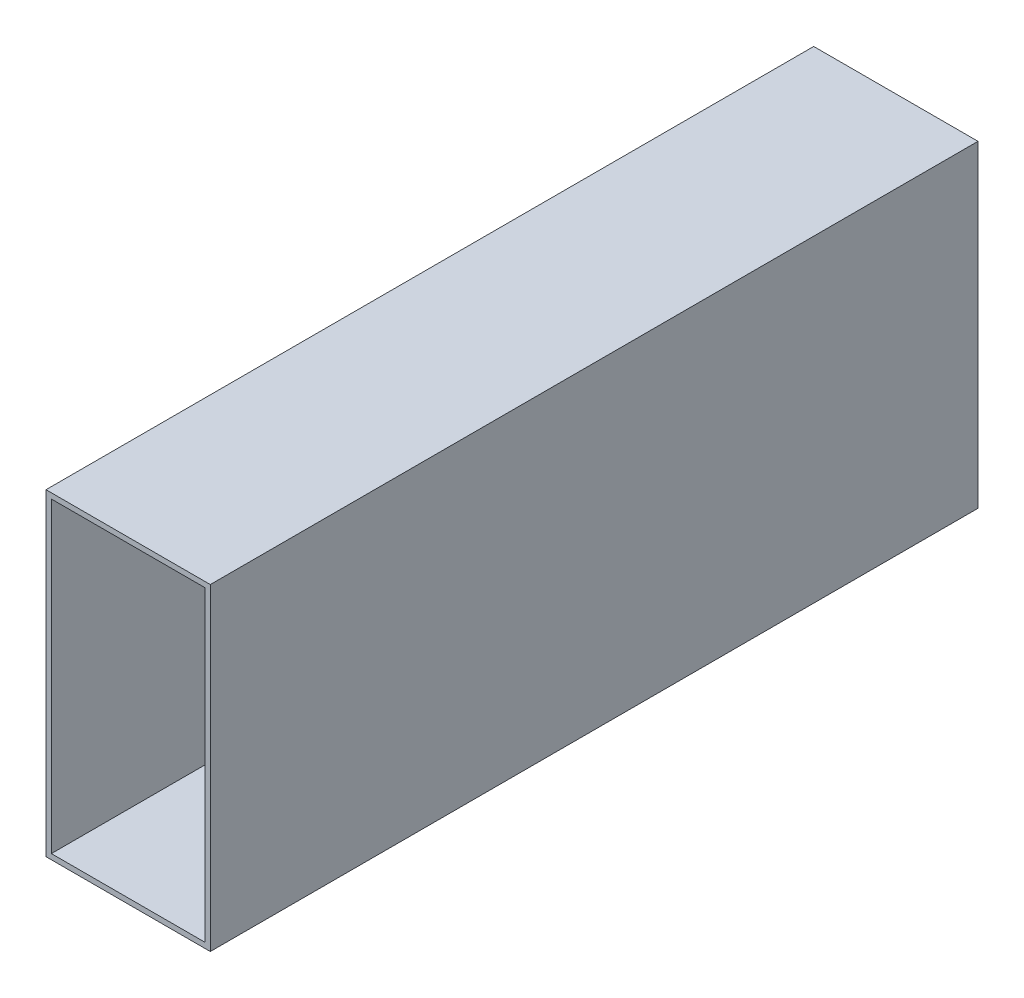
ISO-10303-21;
HEADER;
FILE_DESCRIPTION(('STEP AP214'),'2;1');
FILE_NAME('part.step','',(''),(''),'','','');
FILE_SCHEMA(('AUTOMOTIVE_DESIGN { 1 0 10303 214 1 1 1 1 }'));
ENDSEC;
DATA;
#1=APPLICATION_CONTEXT('core data for automotive mechanical design processes');
#2=APPLICATION_PROTOCOL_DEFINITION('international standard','automotive_design',2000,#1);
#3=PRODUCT_CONTEXT('',#1,'mechanical');
#4=PRODUCT('Part','Part','',(#3));
#5=PRODUCT_RELATED_PRODUCT_CATEGORY('part','',(#4));
#6=PRODUCT_DEFINITION_FORMATION('','',#4);
#7=PRODUCT_DEFINITION_CONTEXT('part definition',#1,'design');
#8=PRODUCT_DEFINITION('design','',#6,#7);
#9=PRODUCT_DEFINITION_SHAPE('','',#8);
#10=(LENGTH_UNIT() NAMED_UNIT(*) SI_UNIT(.MILLI.,.METRE.));
#11=(NAMED_UNIT(*) PLANE_ANGLE_UNIT() SI_UNIT($,.RADIAN.));
#12=(NAMED_UNIT(*) SI_UNIT($,.STERADIAN.) SOLID_ANGLE_UNIT());
#13=UNCERTAINTY_MEASURE_WITH_UNIT(LENGTH_MEASURE(1.E-05),#10,'distance_accuracy_value','');
#14=(GEOMETRIC_REPRESENTATION_CONTEXT(3) GLOBAL_UNCERTAINTY_ASSIGNED_CONTEXT((#13)) GLOBAL_UNIT_ASSIGNED_CONTEXT((#10,
#11,#12)) REPRESENTATION_CONTEXT('',''));
#15=CARTESIAN_POINT('',(0.,0.,0.));
#16=DIRECTION('',(0.,0.,1.));
#17=DIRECTION('',(1.,0.,0.));
#18=AXIS2_PLACEMENT_3D('',#15,#16,#17);
#19=CARTESIAN_POINT('',(0.,0.,127.));
#20=DIRECTION('',(-1.,0.,0.));
#21=DIRECTION('',(0.,-1.,0.));
#22=AXIS2_PLACEMENT_3D('',#19,#20,#21);
#23=PLANE('',#22);
#24=DIRECTION('',(0.,1.,0.));
#25=VECTOR('',#24,1.);
#26=CARTESIAN_POINT('',(0.,0.,0.));
#27=LINE('',#26,#25);
#28=CARTESIAN_POINT('',(0.,0.,0.));
#29=VERTEX_POINT('',#28);
#30=CARTESIAN_POINT('',(0.,52.578,0.));
#31=VERTEX_POINT('',#30);
#32=EDGE_CURVE('E168',#29,#31,#27,.T.);
#33=ORIENTED_EDGE('',*,*,#32,.F.);
#34=DIRECTION('',(0.,0.,-1.));
#35=VECTOR('',#34,1.);
#36=CARTESIAN_POINT('',(0.,0.,127.));
#37=LINE('',#36,#35);
#38=CARTESIAN_POINT('',(0.,0.,127.));
#39=VERTEX_POINT('',#38);
#40=EDGE_CURVE('E11',#39,#29,#37,.T.);
#41=ORIENTED_EDGE('',*,*,#40,.F.);
#42=DIRECTION('',(0.,1.,0.));
#43=VECTOR('',#42,1.);
#44=CARTESIAN_POINT('',(0.,0.,127.));
#45=LINE('',#44,#43);
#46=CARTESIAN_POINT('',(0.,52.578,127.));
#47=VERTEX_POINT('',#46);
#48=EDGE_CURVE('E153',#39,#47,#45,.T.);
#49=ORIENTED_EDGE('',*,*,#48,.T.);
#50=DIRECTION('',(0.,0.,-1.));
#51=VECTOR('',#50,1.);
#52=CARTESIAN_POINT('',(0.,52.578,127.));
#53=LINE('',#52,#51);
#54=EDGE_CURVE('E48',#47,#31,#53,.T.);
#55=ORIENTED_EDGE('',*,*,#54,.T.);
#56=EDGE_LOOP('',(#33,#41,#49,#55));
#57=FACE_BOUND('',#56,.T.);
#58=ADVANCED_FACE('F45',(#57),#23,.T.);
#59=CARTESIAN_POINT('',(0.,0.,127.));
#60=DIRECTION('',(0.,1.,0.));
#61=DIRECTION('',(0.,0.,1.));
#62=AXIS2_PLACEMENT_3D('',#59,#60,#61);
#63=PLANE('',#62);
#64=DIRECTION('',(1.,0.,0.));
#65=VECTOR('',#64,1.);
#66=CARTESIAN_POINT('',(0.,0.,0.));
#67=LINE('',#66,#65);
#68=CARTESIAN_POINT('',(27.178,0.,0.));
#69=VERTEX_POINT('',#68);
#70=EDGE_CURVE('E158',#29,#69,#67,.T.);
#71=ORIENTED_EDGE('',*,*,#70,.T.);
#72=DIRECTION('',(0.,0.,-1.));
#73=VECTOR('',#72,1.);
#74=CARTESIAN_POINT('',(27.178,0.,127.));
#75=LINE('',#74,#73);
#76=CARTESIAN_POINT('',(27.178,0.,127.));
#77=VERTEX_POINT('',#76);
#78=EDGE_CURVE('E54',#77,#69,#75,.T.);
#79=ORIENTED_EDGE('',*,*,#78,.F.);
#80=DIRECTION('',(1.,0.,0.));
#81=VECTOR('',#80,1.);
#82=CARTESIAN_POINT('',(0.,0.,127.));
#83=LINE('',#82,#81);
#84=EDGE_CURVE('E165',#39,#77,#83,.T.);
#85=ORIENTED_EDGE('',*,*,#84,.F.);
#86=ORIENTED_EDGE('',*,*,#40,.T.);
#87=EDGE_LOOP('',(#71,#79,#85,#86));
#88=FACE_BOUND('',#87,.T.);
#89=ADVANCED_FACE('F199',(#88),#63,.F.);
#90=CARTESIAN_POINT('',(27.178,0.,127.));
#91=DIRECTION('',(-1.,0.,0.));
#92=DIRECTION('',(0.,-1.,0.));
#93=AXIS2_PLACEMENT_3D('',#90,#91,#92);
#94=PLANE('',#93);
#95=DIRECTION('',(0.,1.,0.));
#96=VECTOR('',#95,1.);
#97=CARTESIAN_POINT('',(27.178,0.,0.));
#98=LINE('',#97,#96);
#99=CARTESIAN_POINT('',(27.178,52.578,0.));
#100=VERTEX_POINT('',#99);
#101=EDGE_CURVE('E176',#69,#100,#98,.T.);
#102=ORIENTED_EDGE('',*,*,#101,.T.);
#103=DIRECTION('',(0.,0.,-1.));
#104=VECTOR('',#103,1.);
#105=CARTESIAN_POINT('',(27.178,52.578,127.));
#106=LINE('',#105,#104);
#107=CARTESIAN_POINT('',(27.178,52.578,127.));
#108=VERTEX_POINT('',#107);
#109=EDGE_CURVE('E184',#108,#100,#106,.T.);
#110=ORIENTED_EDGE('',*,*,#109,.F.);
#111=DIRECTION('',(0.,1.,0.));
#112=VECTOR('',#111,1.);
#113=CARTESIAN_POINT('',(27.178,0.,127.));
#114=LINE('',#113,#112);
#115=EDGE_CURVE('E162',#77,#108,#114,.T.);
#116=ORIENTED_EDGE('',*,*,#115,.F.);
#117=ORIENTED_EDGE('',*,*,#78,.T.);
#118=EDGE_LOOP('',(#102,#110,#116,#117));
#119=FACE_BOUND('',#118,.T.);
#120=ADVANCED_FACE('F203',(#119),#94,.F.);
#121=CARTESIAN_POINT('',(0.,52.578,127.));
#122=DIRECTION('',(0.,1.,0.));
#123=DIRECTION('',(0.,0.,1.));
#124=AXIS2_PLACEMENT_3D('',#121,#122,#123);
#125=PLANE('',#124);
#126=DIRECTION('',(1.,0.,0.));
#127=VECTOR('',#126,1.);
#128=CARTESIAN_POINT('',(0.,52.578,0.));
#129=LINE('',#128,#127);
#130=EDGE_CURVE('E172',#31,#100,#129,.T.);
#131=ORIENTED_EDGE('',*,*,#130,.F.);
#132=ORIENTED_EDGE('',*,*,#54,.F.);
#133=DIRECTION('',(1.,0.,0.));
#134=VECTOR('',#133,1.);
#135=CARTESIAN_POINT('',(0.,52.578,127.));
#136=LINE('',#135,#134);
#137=EDGE_CURVE('E157',#47,#108,#136,.T.);
#138=ORIENTED_EDGE('',*,*,#137,.T.);
#139=ORIENTED_EDGE('',*,*,#109,.T.);
#140=EDGE_LOOP('',(#131,#132,#138,#139));
#141=FACE_BOUND('',#140,.T.);
#142=ADVANCED_FACE('F194',(#141),#125,.T.);
#143=CARTESIAN_POINT('',(0.,0.,127.));
#144=DIRECTION('',(0.,0.,-1.));
#145=DIRECTION('',(-1.,0.,0.));
#146=AXIS2_PLACEMENT_3D('',#143,#144,#145);
#147=PLANE('',#146);
#148=DIRECTION('',(1.,0.,0.));
#149=VECTOR('',#148,1.);
#150=CARTESIAN_POINT('',(0.,0.889,127.));
#151=LINE('',#150,#149);
#152=CARTESIAN_POINT('',(0.889,0.889,127.));
#153=VERTEX_POINT('',#152);
#154=CARTESIAN_POINT('',(26.289,0.889,127.));
#155=VERTEX_POINT('',#154);
#156=EDGE_CURVE('E121',#153,#155,#151,.T.);
#157=ORIENTED_EDGE('',*,*,#156,.F.);
#158=DIRECTION('',(0.,1.,0.));
#159=VECTOR('',#158,1.);
#160=CARTESIAN_POINT('',(0.889,0.,127.));
#161=LINE('',#160,#159);
#162=CARTESIAN_POINT('',(0.888999999999993,51.689,127.));
#163=VERTEX_POINT('',#162);
#164=EDGE_CURVE('E143',#153,#163,#161,.T.);
#165=ORIENTED_EDGE('',*,*,#164,.T.);
#166=DIRECTION('',(1.,0.,0.));
#167=VECTOR('',#166,1.);
#168=CARTESIAN_POINT('',(0.,51.689,127.));
#169=LINE('',#168,#167);
#170=CARTESIAN_POINT('',(26.289,51.689,127.));
#171=VERTEX_POINT('',#170);
#172=EDGE_CURVE('E116',#163,#171,#169,.T.);
#173=ORIENTED_EDGE('',*,*,#172,.T.);
#174=DIRECTION('',(0.,1.,0.));
#175=VECTOR('',#174,1.);
#176=CARTESIAN_POINT('',(26.289,0.,127.));
#177=LINE('',#176,#175);
#178=EDGE_CURVE('E148',#155,#171,#177,.T.);
#179=ORIENTED_EDGE('',*,*,#178,.F.);
#180=EDGE_LOOP('',(#157,#165,#173,#179));
#181=FACE_BOUND('',#180,.T.);
#182=ORIENTED_EDGE('',*,*,#48,.F.);
#183=ORIENTED_EDGE('',*,*,#84,.T.);
#184=ORIENTED_EDGE('',*,*,#115,.T.);
#185=ORIENTED_EDGE('',*,*,#137,.F.);
#186=EDGE_LOOP('',(#182,#183,#184,#185));
#187=FACE_BOUND('',#186,.T.);
#188=ADVANCED_FACE('F205',(#181,#187),#147,.F.);
#189=CARTESIAN_POINT('',(0.,0.,0.));
#190=DIRECTION('',(0.,0.,-1.));
#191=DIRECTION('',(-1.,0.,0.));
#192=AXIS2_PLACEMENT_3D('',#189,#190,#191);
#193=PLANE('',#192);
#194=DIRECTION('',(0.,1.,0.));
#195=VECTOR('',#194,1.);
#196=CARTESIAN_POINT('',(0.889,0.,0.));
#197=LINE('',#196,#195);
#198=CARTESIAN_POINT('',(0.889,0.889,0.));
#199=VERTEX_POINT('',#198);
#200=CARTESIAN_POINT('',(0.888999999999993,51.689,0.));
#201=VERTEX_POINT('',#200);
#202=EDGE_CURVE('E124',#199,#201,#197,.T.);
#203=ORIENTED_EDGE('',*,*,#202,.F.);
#204=DIRECTION('',(1.,0.,0.));
#205=VECTOR('',#204,1.);
#206=CARTESIAN_POINT('',(0.,0.889,0.));
#207=LINE('',#206,#205);
#208=CARTESIAN_POINT('',(26.289,0.889,0.));
#209=VERTEX_POINT('',#208);
#210=EDGE_CURVE('E137',#199,#209,#207,.T.);
#211=ORIENTED_EDGE('',*,*,#210,.T.);
#212=DIRECTION('',(0.,1.,0.));
#213=VECTOR('',#212,1.);
#214=CARTESIAN_POINT('',(26.289,0.,0.));
#215=LINE('',#214,#213);
#216=CARTESIAN_POINT('',(26.289,51.689,0.));
#217=VERTEX_POINT('',#216);
#218=EDGE_CURVE('E69',#209,#217,#215,.T.);
#219=ORIENTED_EDGE('',*,*,#218,.T.);
#220=DIRECTION('',(1.,0.,0.));
#221=VECTOR('',#220,1.);
#222=CARTESIAN_POINT('',(0.,51.689,0.));
#223=LINE('',#222,#221);
#224=EDGE_CURVE('E114',#201,#217,#223,.T.);
#225=ORIENTED_EDGE('',*,*,#224,.F.);
#226=EDGE_LOOP('',(#203,#211,#219,#225));
#227=FACE_BOUND('',#226,.T.);
#228=ORIENTED_EDGE('',*,*,#32,.T.);
#229=ORIENTED_EDGE('',*,*,#130,.T.);
#230=ORIENTED_EDGE('',*,*,#101,.F.);
#231=ORIENTED_EDGE('',*,*,#70,.F.);
#232=EDGE_LOOP('',(#228,#229,#230,#231));
#233=FACE_BOUND('',#232,.T.);
#234=ADVANCED_FACE('F132',(#227,#233),#193,.T.);
#235=CARTESIAN_POINT('',(0.889,0.,127.));
#236=DIRECTION('',(-1.,0.,0.));
#237=DIRECTION('',(0.,-1.,0.));
#238=AXIS2_PLACEMENT_3D('',#235,#236,#237);
#239=PLANE('',#238);
#240=ORIENTED_EDGE('',*,*,#202,.T.);
#241=DIRECTION('',(0.,0.,-1.));
#242=VECTOR('',#241,1.);
#243=CARTESIAN_POINT('',(0.888999999999993,51.689,127.));
#244=LINE('',#243,#242);
#245=EDGE_CURVE('E110',#163,#201,#244,.T.);
#246=ORIENTED_EDGE('',*,*,#245,.F.);
#247=ORIENTED_EDGE('',*,*,#164,.F.);
#248=DIRECTION('',(0.,0.,-1.));
#249=VECTOR('',#248,1.);
#250=CARTESIAN_POINT('',(0.889,0.889,127.));
#251=LINE('',#250,#249);
#252=EDGE_CURVE('E126',#153,#199,#251,.T.);
#253=ORIENTED_EDGE('',*,*,#252,.T.);
#254=EDGE_LOOP('',(#240,#246,#247,#253));
#255=FACE_BOUND('',#254,.T.);
#256=ADVANCED_FACE('F125',(#255),#239,.F.);
#257=CARTESIAN_POINT('',(0.,0.889,127.));
#258=DIRECTION('',(0.,1.,0.));
#259=DIRECTION('',(0.,0.,1.));
#260=AXIS2_PLACEMENT_3D('',#257,#258,#259);
#261=PLANE('',#260);
#262=ORIENTED_EDGE('',*,*,#210,.F.);
#263=ORIENTED_EDGE('',*,*,#252,.F.);
#264=ORIENTED_EDGE('',*,*,#156,.T.);
#265=DIRECTION('',(0.,0.,-1.));
#266=VECTOR('',#265,1.);
#267=CARTESIAN_POINT('',(26.289,0.889,127.));
#268=LINE('',#267,#266);
#269=EDGE_CURVE('E280',#155,#209,#268,.T.);
#270=ORIENTED_EDGE('',*,*,#269,.T.);
#271=EDGE_LOOP('',(#262,#263,#264,#270));
#272=FACE_BOUND('',#271,.T.);
#273=ADVANCED_FACE('F252',(#272),#261,.T.);
#274=CARTESIAN_POINT('',(26.289,0.,127.));
#275=DIRECTION('',(-1.,0.,0.));
#276=DIRECTION('',(0.,-1.,0.));
#277=AXIS2_PLACEMENT_3D('',#274,#275,#276);
#278=PLANE('',#277);
#279=ORIENTED_EDGE('',*,*,#218,.F.);
#280=ORIENTED_EDGE('',*,*,#269,.F.);
#281=ORIENTED_EDGE('',*,*,#178,.T.);
#282=DIRECTION('',(0.,0.,-1.));
#283=VECTOR('',#282,1.);
#284=CARTESIAN_POINT('',(26.289,51.689,127.));
#285=LINE('',#284,#283);
#286=EDGE_CURVE('E62',#171,#217,#285,.T.);
#287=ORIENTED_EDGE('',*,*,#286,.T.);
#288=EDGE_LOOP('',(#279,#280,#281,#287));
#289=FACE_BOUND('',#288,.T.);
#290=ADVANCED_FACE('F261',(#289),#278,.T.);
#291=CARTESIAN_POINT('',(0.,51.689,127.));
#292=DIRECTION('',(0.,1.,0.));
#293=DIRECTION('',(0.,0.,1.));
#294=AXIS2_PLACEMENT_3D('',#291,#292,#293);
#295=PLANE('',#294);
#296=ORIENTED_EDGE('',*,*,#224,.T.);
#297=ORIENTED_EDGE('',*,*,#286,.F.);
#298=ORIENTED_EDGE('',*,*,#172,.F.);
#299=ORIENTED_EDGE('',*,*,#245,.T.);
#300=EDGE_LOOP('',(#296,#297,#298,#299));
#301=FACE_BOUND('',#300,.T.);
#302=ADVANCED_FACE('F112',(#301),#295,.F.);
#303=CLOSED_SHELL('',(#58,#89,#120,#142,#188,#234,#256,#273,#290,#302));
#304=MANIFOLD_SOLID_BREP('B2',#303);
#305=ADVANCED_BREP_SHAPE_REPRESENTATION('',(#18,#304),#14);
#306=SHAPE_DEFINITION_REPRESENTATION(#9,#305);
ENDSEC;
END-ISO-10303-21;
